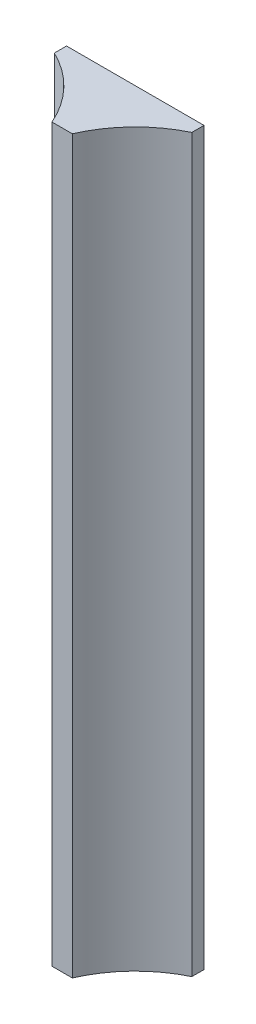
ISO-10303-21;
HEADER;
FILE_DESCRIPTION(('STEP AP214'),'2;1');
FILE_NAME('part.step','',(''),(''),'','','');
FILE_SCHEMA(('AUTOMOTIVE_DESIGN { 1 0 10303 214 1 1 1 1 }'));
ENDSEC;
DATA;
#1=APPLICATION_CONTEXT('core data for automotive mechanical design processes');
#2=APPLICATION_PROTOCOL_DEFINITION('international standard','automotive_design',2000,#1);
#3=PRODUCT_CONTEXT('',#1,'mechanical');
#4=PRODUCT('Part','Part','',(#3));
#5=PRODUCT_RELATED_PRODUCT_CATEGORY('part','',(#4));
#6=PRODUCT_DEFINITION_FORMATION('','',#4);
#7=PRODUCT_DEFINITION_CONTEXT('part definition',#1,'design');
#8=PRODUCT_DEFINITION('design','',#6,#7);
#9=PRODUCT_DEFINITION_SHAPE('','',#8);
#10=(LENGTH_UNIT() NAMED_UNIT(*) SI_UNIT(.MILLI.,.METRE.));
#11=(NAMED_UNIT(*) PLANE_ANGLE_UNIT() SI_UNIT($,.RADIAN.));
#12=(NAMED_UNIT(*) SI_UNIT($,.STERADIAN.) SOLID_ANGLE_UNIT());
#13=UNCERTAINTY_MEASURE_WITH_UNIT(LENGTH_MEASURE(1.E-05),#10,'distance_accuracy_value','');
#14=(GEOMETRIC_REPRESENTATION_CONTEXT(3) GLOBAL_UNCERTAINTY_ASSIGNED_CONTEXT((#13)) GLOBAL_UNIT_ASSIGNED_CONTEXT((#10,
#11,#12)) REPRESENTATION_CONTEXT('',''));
#15=CARTESIAN_POINT('',(0.,0.,0.));
#16=DIRECTION('',(0.,0.,1.));
#17=DIRECTION('',(1.,0.,0.));
#18=AXIS2_PLACEMENT_3D('',#15,#16,#17);
#19=CARTESIAN_POINT('',(-10.,60.,4.));
#20=DIRECTION('',(0.,-1.,0.));
#21=DIRECTION('',(0.,0.,-1.));
#22=AXIS2_PLACEMENT_3D('',#19,#20,#21);
#23=CYLINDRICAL_SURFACE('',#22,10.);
#24=CARTESIAN_POINT('',(-10.,0.,4.));
#25=DIRECTION('',(0.,-1.,0.));
#26=DIRECTION('',(0.,0.,-1.));
#27=AXIS2_PLACEMENT_3D('',#24,#25,#26);
#28=CIRCLE('',#27,10.);
#29=CARTESIAN_POINT('',(-5.64110105645933,0.,-5.));
#30=VERTEX_POINT('',#29);
#31=CARTESIAN_POINT('',(-0.834848610088317,0.,0.));
#32=VERTEX_POINT('',#31);
#33=EDGE_CURVE('E120',#30,#32,#28,.T.);
#34=ORIENTED_EDGE('',*,*,#33,.T.);
#35=DIRECTION('',(0.,-1.,0.));
#36=VECTOR('',#35,1.);
#37=CARTESIAN_POINT('',(-0.834848610088317,60.,0.));
#38=LINE('',#37,#36);
#39=CARTESIAN_POINT('',(-0.834848610088317,60.,0.));
#40=VERTEX_POINT('',#39);
#41=EDGE_CURVE('E11',#40,#32,#38,.T.);
#42=ORIENTED_EDGE('',*,*,#41,.F.);
#43=CARTESIAN_POINT('',(-10.,60.,4.));
#44=DIRECTION('',(0.,-1.,0.));
#45=DIRECTION('',(0.,0.,-1.));
#46=AXIS2_PLACEMENT_3D('',#43,#44,#45);
#47=CIRCLE('',#46,10.);
#48=CARTESIAN_POINT('',(-5.64110105645933,60.,-5.));
#49=VERTEX_POINT('',#48);
#50=EDGE_CURVE('E130',#49,#40,#47,.T.);
#51=ORIENTED_EDGE('',*,*,#50,.F.);
#52=DIRECTION('',(0.,-1.,0.));
#53=VECTOR('',#52,1.);
#54=CARTESIAN_POINT('',(-5.64110105645933,60.,-5.));
#55=LINE('',#54,#53);
#56=EDGE_CURVE('E116',#49,#30,#55,.T.);
#57=ORIENTED_EDGE('',*,*,#56,.T.);
#58=EDGE_LOOP('',(#34,#42,#51,#57));
#59=FACE_BOUND('',#58,.T.);
#60=ADVANCED_FACE('F36',(#59),#23,.F.);
#61=CARTESIAN_POINT('',(-0.834848610088317,60.,0.));
#62=DIRECTION('',(0.,0.,-1.));
#63=DIRECTION('',(-1.,0.,0.));
#64=AXIS2_PLACEMENT_3D('',#61,#62,#63);
#65=PLANE('',#64);
#66=DIRECTION('',(1.,0.,0.));
#67=VECTOR('',#66,1.);
#68=CARTESIAN_POINT('',(-0.834848610088317,0.,0.));
#69=LINE('',#68,#67);
#70=CARTESIAN_POINT('',(0.834848610088321,0.,0.));
#71=VERTEX_POINT('',#70);
#72=EDGE_CURVE('E123',#32,#71,#69,.T.);
#73=ORIENTED_EDGE('',*,*,#72,.T.);
#74=DIRECTION('',(0.,-1.,0.));
#75=VECTOR('',#74,1.);
#76=CARTESIAN_POINT('',(0.834848610088321,60.,0.));
#77=LINE('',#76,#75);
#78=CARTESIAN_POINT('',(0.834848610088321,60.,0.));
#79=VERTEX_POINT('',#78);
#80=EDGE_CURVE('E44',#79,#71,#77,.T.);
#81=ORIENTED_EDGE('',*,*,#80,.F.);
#82=DIRECTION('',(1.,0.,0.));
#83=VECTOR('',#82,1.);
#84=CARTESIAN_POINT('',(-0.834848610088317,60.,0.));
#85=LINE('',#84,#83);
#86=EDGE_CURVE('E89',#40,#79,#85,.T.);
#87=ORIENTED_EDGE('',*,*,#86,.F.);
#88=ORIENTED_EDGE('',*,*,#41,.T.);
#89=EDGE_LOOP('',(#73,#81,#87,#88));
#90=FACE_BOUND('',#89,.T.);
#91=ADVANCED_FACE('F154',(#90),#65,.F.);
#92=CARTESIAN_POINT('',(10.,60.,4.));
#93=DIRECTION('',(0.,-1.,0.));
#94=DIRECTION('',(0.,0.,-1.));
#95=AXIS2_PLACEMENT_3D('',#92,#93,#94);
#96=CYLINDRICAL_SURFACE('',#95,10.);
#97=CARTESIAN_POINT('',(10.,0.,4.));
#98=DIRECTION('',(0.,-1.,0.));
#99=DIRECTION('',(0.,0.,-1.));
#100=AXIS2_PLACEMENT_3D('',#97,#98,#99);
#101=CIRCLE('',#100,10.);
#102=CARTESIAN_POINT('',(5.64110105645932,0.,-5.));
#103=VERTEX_POINT('',#102);
#104=EDGE_CURVE('E125',#71,#103,#101,.T.);
#105=ORIENTED_EDGE('',*,*,#104,.T.);
#106=DIRECTION('',(0.,-1.,0.));
#107=VECTOR('',#106,1.);
#108=CARTESIAN_POINT('',(5.64110105645932,60.,-5.));
#109=LINE('',#108,#107);
#110=CARTESIAN_POINT('',(5.64110105645932,60.,-5.));
#111=VERTEX_POINT('',#110);
#112=EDGE_CURVE('E111',#111,#103,#109,.T.);
#113=ORIENTED_EDGE('',*,*,#112,.F.);
#114=CARTESIAN_POINT('',(10.,60.,4.));
#115=DIRECTION('',(0.,-1.,0.));
#116=DIRECTION('',(0.,0.,-1.));
#117=AXIS2_PLACEMENT_3D('',#114,#115,#116);
#118=CIRCLE('',#117,10.);
#119=EDGE_CURVE('E102',#79,#111,#118,.T.);
#120=ORIENTED_EDGE('',*,*,#119,.F.);
#121=ORIENTED_EDGE('',*,*,#80,.T.);
#122=EDGE_LOOP('',(#105,#113,#120,#121));
#123=FACE_BOUND('',#122,.T.);
#124=ADVANCED_FACE('F136',(#123),#96,.F.);
#125=CARTESIAN_POINT('',(5.64110105645933,60.,-5.));
#126=DIRECTION('',(-1.,0.,0.));
#127=DIRECTION('',(0.,0.,1.));
#128=AXIS2_PLACEMENT_3D('',#125,#126,#127);
#129=PLANE('',#128);
#130=DIRECTION('',(0.,0.,-1.));
#131=VECTOR('',#130,1.);
#132=CARTESIAN_POINT('',(5.64110105645933,0.,-5.));
#133=LINE('',#132,#131);
#134=CARTESIAN_POINT('',(5.64110105645933,0.,-6.));
#135=VERTEX_POINT('',#134);
#136=EDGE_CURVE('E110',#103,#135,#133,.T.);
#137=ORIENTED_EDGE('',*,*,#136,.T.);
#138=DIRECTION('',(0.,-1.,0.));
#139=VECTOR('',#138,1.);
#140=CARTESIAN_POINT('',(5.64110105645933,60.,-6.));
#141=LINE('',#140,#139);
#142=CARTESIAN_POINT('',(5.64110105645933,60.,-6.));
#143=VERTEX_POINT('',#142);
#144=EDGE_CURVE('E107',#143,#135,#141,.T.);
#145=ORIENTED_EDGE('',*,*,#144,.F.);
#146=DIRECTION('',(0.,0.,-1.));
#147=VECTOR('',#146,1.);
#148=CARTESIAN_POINT('',(5.64110105645933,60.,-5.));
#149=LINE('',#148,#147);
#150=EDGE_CURVE('E96',#111,#143,#149,.T.);
#151=ORIENTED_EDGE('',*,*,#150,.F.);
#152=ORIENTED_EDGE('',*,*,#112,.T.);
#153=EDGE_LOOP('',(#137,#145,#151,#152));
#154=FACE_BOUND('',#153,.T.);
#155=ADVANCED_FACE('F108',(#154),#129,.F.);
#156=CARTESIAN_POINT('',(5.64110105645933,60.,-6.));
#157=DIRECTION('',(0.,0.,1.));
#158=DIRECTION('',(1.,0.,0.));
#159=AXIS2_PLACEMENT_3D('',#156,#157,#158);
#160=PLANE('',#159);
#161=DIRECTION('',(-1.,0.,0.));
#162=VECTOR('',#161,1.);
#163=CARTESIAN_POINT('',(5.64110105645933,0.,-6.));
#164=LINE('',#163,#162);
#165=CARTESIAN_POINT('',(-5.64110105645933,0.,-6.));
#166=VERTEX_POINT('',#165);
#167=EDGE_CURVE('E75',#135,#166,#164,.T.);
#168=ORIENTED_EDGE('',*,*,#167,.T.);
#169=DIRECTION('',(0.,-1.,0.));
#170=VECTOR('',#169,1.);
#171=CARTESIAN_POINT('',(-5.64110105645933,60.,-6.));
#172=LINE('',#171,#170);
#173=CARTESIAN_POINT('',(-5.64110105645933,60.,-6.));
#174=VERTEX_POINT('',#173);
#175=EDGE_CURVE('E112',#174,#166,#172,.T.);
#176=ORIENTED_EDGE('',*,*,#175,.F.);
#177=DIRECTION('',(-1.,0.,0.));
#178=VECTOR('',#177,1.);
#179=CARTESIAN_POINT('',(5.64110105645933,60.,-6.));
#180=LINE('',#179,#178);
#181=EDGE_CURVE('E100',#143,#174,#180,.T.);
#182=ORIENTED_EDGE('',*,*,#181,.F.);
#183=ORIENTED_EDGE('',*,*,#144,.T.);
#184=EDGE_LOOP('',(#168,#176,#182,#183));
#185=FACE_BOUND('',#184,.T.);
#186=ADVANCED_FACE('F114',(#185),#160,.F.);
#187=CARTESIAN_POINT('',(-5.64110105645933,60.,-6.));
#188=DIRECTION('',(1.,0.,0.));
#189=DIRECTION('',(0.,0.,-1.));
#190=AXIS2_PLACEMENT_3D('',#187,#188,#189);
#191=PLANE('',#190);
#192=DIRECTION('',(0.,0.,1.));
#193=VECTOR('',#192,1.);
#194=CARTESIAN_POINT('',(-5.64110105645933,0.,-6.));
#195=LINE('',#194,#193);
#196=EDGE_CURVE('E81',#166,#30,#195,.T.);
#197=ORIENTED_EDGE('',*,*,#196,.T.);
#198=ORIENTED_EDGE('',*,*,#56,.F.);
#199=DIRECTION('',(0.,0.,1.));
#200=VECTOR('',#199,1.);
#201=CARTESIAN_POINT('',(-5.64110105645933,60.,-6.));
#202=LINE('',#201,#200);
#203=EDGE_CURVE('E52',#174,#49,#202,.T.);
#204=ORIENTED_EDGE('',*,*,#203,.F.);
#205=ORIENTED_EDGE('',*,*,#175,.T.);
#206=EDGE_LOOP('',(#197,#198,#204,#205));
#207=FACE_BOUND('',#206,.T.);
#208=ADVANCED_FACE('F143',(#207),#191,.F.);
#209=CARTESIAN_POINT('',(-10.,60.,4.));
#210=DIRECTION('',(0.,-1.,0.));
#211=DIRECTION('',(0.,0.,-1.));
#212=AXIS2_PLACEMENT_3D('',#209,#210,#211);
#213=PLANE('',#212);
#214=ORIENTED_EDGE('',*,*,#50,.T.);
#215=ORIENTED_EDGE('',*,*,#86,.T.);
#216=ORIENTED_EDGE('',*,*,#119,.T.);
#217=ORIENTED_EDGE('',*,*,#150,.T.);
#218=ORIENTED_EDGE('',*,*,#181,.T.);
#219=ORIENTED_EDGE('',*,*,#203,.T.);
#220=EDGE_LOOP('',(#214,#215,#216,#217,#218,#219));
#221=FACE_BOUND('',#220,.T.);
#222=ADVANCED_FACE('F98',(#221),#213,.F.);
#223=CARTESIAN_POINT('',(-10.,0.,4.));
#224=DIRECTION('',(0.,-1.,0.));
#225=DIRECTION('',(0.,0.,-1.));
#226=AXIS2_PLACEMENT_3D('',#223,#224,#225);
#227=PLANE('',#226);
#228=ORIENTED_EDGE('',*,*,#33,.F.);
#229=ORIENTED_EDGE('',*,*,#196,.F.);
#230=ORIENTED_EDGE('',*,*,#167,.F.);
#231=ORIENTED_EDGE('',*,*,#136,.F.);
#232=ORIENTED_EDGE('',*,*,#104,.F.);
#233=ORIENTED_EDGE('',*,*,#72,.F.);
#234=EDGE_LOOP('',(#228,#229,#230,#231,#232,#233));
#235=FACE_BOUND('',#234,.T.);
#236=ADVANCED_FACE('F139',(#235),#227,.T.);
#237=CLOSED_SHELL('',(#60,#91,#124,#155,#186,#208,#222,#236));
#238=MANIFOLD_SOLID_BREP('B2',#237);
#239=ADVANCED_BREP_SHAPE_REPRESENTATION('',(#18,#238),#14);
#240=SHAPE_DEFINITION_REPRESENTATION(#9,#239);
ENDSEC;
END-ISO-10303-21;
